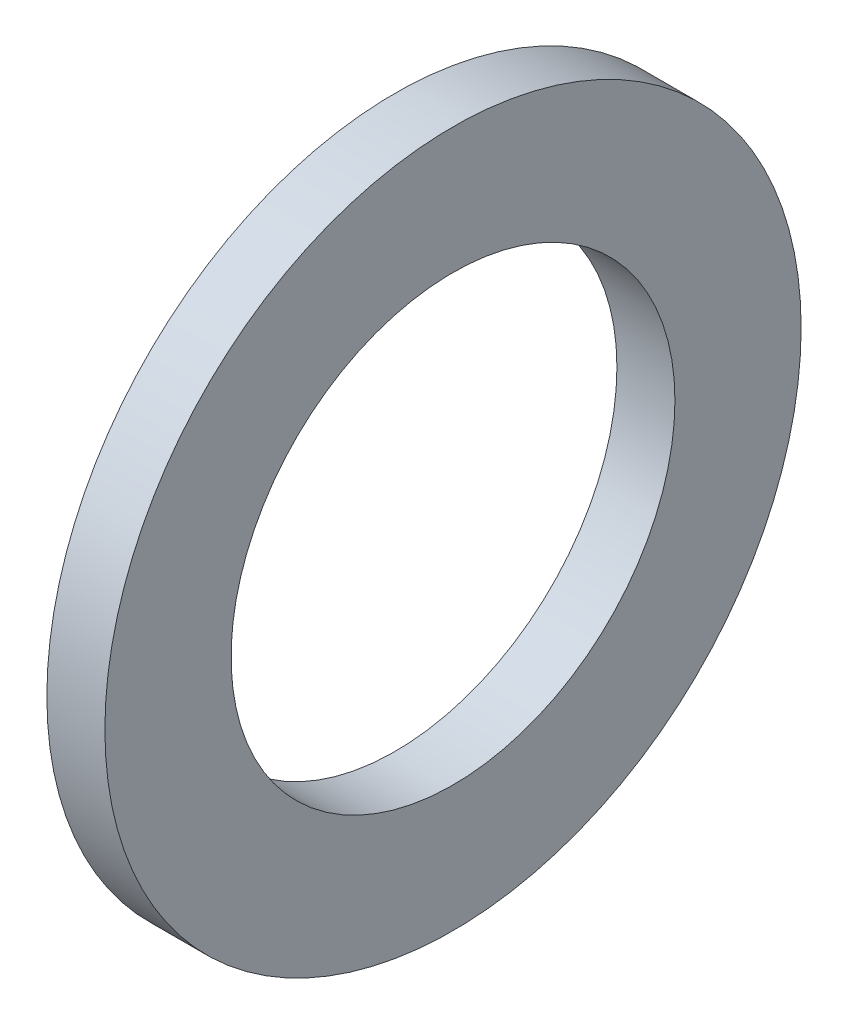
ISO-10303-21;
HEADER;
FILE_DESCRIPTION(('STEP AP214'),'2;1');
FILE_NAME('part.step','',(''),(''),'','','');
FILE_SCHEMA(('AUTOMOTIVE_DESIGN { 1 0 10303 214 1 1 1 1 }'));
ENDSEC;
DATA;
#1=APPLICATION_CONTEXT('core data for automotive mechanical design processes');
#2=APPLICATION_PROTOCOL_DEFINITION('international standard','automotive_design',2000,#1);
#3=PRODUCT_CONTEXT('',#1,'mechanical');
#4=PRODUCT('Part','Part','',(#3));
#5=PRODUCT_RELATED_PRODUCT_CATEGORY('part','',(#4));
#6=PRODUCT_DEFINITION_FORMATION('','',#4);
#7=PRODUCT_DEFINITION_CONTEXT('part definition',#1,'design');
#8=PRODUCT_DEFINITION('design','',#6,#7);
#9=PRODUCT_DEFINITION_SHAPE('','',#8);
#10=(LENGTH_UNIT() NAMED_UNIT(*) SI_UNIT(.MILLI.,.METRE.));
#11=(NAMED_UNIT(*) PLANE_ANGLE_UNIT() SI_UNIT($,.RADIAN.));
#12=(NAMED_UNIT(*) SI_UNIT($,.STERADIAN.) SOLID_ANGLE_UNIT());
#13=UNCERTAINTY_MEASURE_WITH_UNIT(LENGTH_MEASURE(1.E-05),#10,'distance_accuracy_value','');
#14=(GEOMETRIC_REPRESENTATION_CONTEXT(3) GLOBAL_UNCERTAINTY_ASSIGNED_CONTEXT((#13)) GLOBAL_UNIT_ASSIGNED_CONTEXT((#10,
#11,#12)) REPRESENTATION_CONTEXT('',''));
#15=CARTESIAN_POINT('',(0.,0.,0.));
#16=DIRECTION('',(0.,0.,1.));
#17=DIRECTION('',(1.,0.,0.));
#18=AXIS2_PLACEMENT_3D('',#15,#16,#17);
#19=CARTESIAN_POINT('',(0.008400000000002,12.0084,12.0084));
#20=DIRECTION('',(1.,0.,0.));
#21=DIRECTION('',(0.,0.,-1.));
#22=AXIS2_PLACEMENT_3D('',#19,#20,#21);
#23=PLANE('',#22);
#24=CARTESIAN_POINT('',(0.008400000000002,12.0084,12.0084));
#25=DIRECTION('',(1.,0.,0.));
#26=DIRECTION('',(0.,0.,-1.));
#27=AXIS2_PLACEMENT_3D('',#24,#25,#26);
#28=CIRCLE('',#27,7.65);
#29=CARTESIAN_POINT('',(0.008400000000002,12.0084,4.3584));
#30=VERTEX_POINT('',#29);
#31=EDGE_CURVE('E26',#30,#30,#28,.T.);
#32=ORIENTED_EDGE('',*,*,#31,.T.);
#33=EDGE_LOOP('',(#32));
#34=FACE_BOUND('',#33,.T.);
#35=CARTESIAN_POINT('',(0.008400000000002,12.0084,12.0084));
#36=DIRECTION('',(1.,0.,0.));
#37=DIRECTION('',(0.,0.,-1.));
#38=AXIS2_PLACEMENT_3D('',#35,#36,#37);
#39=CIRCLE('',#38,12.);
#40=CARTESIAN_POINT('',(0.008400000000002,12.0084,0.00840000000000042));
#41=VERTEX_POINT('',#40);
#42=EDGE_CURVE('E17',#41,#41,#39,.T.);
#43=ORIENTED_EDGE('',*,*,#42,.F.);
#44=EDGE_LOOP('',(#43));
#45=FACE_BOUND('',#44,.T.);
#46=ADVANCED_FACE('F14',(#34,#45),#23,.F.);
#47=CARTESIAN_POINT('',(0.008400000000002,12.0084,12.0084));
#48=DIRECTION('',(1.,0.,0.));
#49=DIRECTION('',(0.,0.,-1.));
#50=AXIS2_PLACEMENT_3D('',#47,#48,#49);
#51=CYLINDRICAL_SURFACE('',#50,12.);
#52=ORIENTED_EDGE('',*,*,#42,.T.);
#53=EDGE_LOOP('',(#52));
#54=FACE_BOUND('',#53,.T.);
#55=CARTESIAN_POINT('',(2.0084,12.0084,12.0084));
#56=DIRECTION('',(1.,0.,0.));
#57=DIRECTION('',(0.,0.,-1.));
#58=AXIS2_PLACEMENT_3D('',#55,#56,#57);
#59=CIRCLE('',#58,12.);
#60=CARTESIAN_POINT('',(2.0084,12.0084,0.00840000000000042));
#61=VERTEX_POINT('',#60);
#62=EDGE_CURVE('E21',#61,#61,#59,.T.);
#63=ORIENTED_EDGE('',*,*,#62,.F.);
#64=EDGE_LOOP('',(#63));
#65=FACE_BOUND('',#64,.T.);
#66=ADVANCED_FACE('F34',(#54,#65),#51,.T.);
#67=CARTESIAN_POINT('',(0.008400000000002,12.0084,12.0084));
#68=DIRECTION('',(1.,0.,0.));
#69=DIRECTION('',(0.,0.,-1.));
#70=AXIS2_PLACEMENT_3D('',#67,#68,#69);
#71=CYLINDRICAL_SURFACE('',#70,7.65);
#72=ORIENTED_EDGE('',*,*,#31,.F.);
#73=EDGE_LOOP('',(#72));
#74=FACE_BOUND('',#73,.T.);
#75=CARTESIAN_POINT('',(2.0084,12.0084,12.0084));
#76=DIRECTION('',(1.,0.,0.));
#77=DIRECTION('',(0.,0.,-1.));
#78=AXIS2_PLACEMENT_3D('',#75,#76,#77);
#79=CIRCLE('',#78,7.65);
#80=CARTESIAN_POINT('',(2.0084,12.0084,4.3584));
#81=VERTEX_POINT('',#80);
#82=EDGE_CURVE('E10',#81,#81,#79,.F.);
#83=ORIENTED_EDGE('',*,*,#82,.F.);
#84=EDGE_LOOP('',(#83));
#85=FACE_BOUND('',#84,.T.);
#86=ADVANCED_FACE('F42',(#74,#85),#71,.F.);
#87=CARTESIAN_POINT('',(2.0084,12.0084,12.0084));
#88=DIRECTION('',(1.,0.,0.));
#89=DIRECTION('',(0.,0.,-1.));
#90=AXIS2_PLACEMENT_3D('',#87,#88,#89);
#91=PLANE('',#90);
#92=ORIENTED_EDGE('',*,*,#82,.T.);
#93=EDGE_LOOP('',(#92));
#94=FACE_BOUND('',#93,.T.);
#95=ORIENTED_EDGE('',*,*,#62,.T.);
#96=EDGE_LOOP('',(#95));
#97=FACE_BOUND('',#96,.T.);
#98=ADVANCED_FACE('F43',(#94,#97),#91,.T.);
#99=CLOSED_SHELL('',(#46,#66,#86,#98));
#100=MANIFOLD_SOLID_BREP('B1',#99);
#101=ADVANCED_BREP_SHAPE_REPRESENTATION('',(#18,#100),#14);
#102=SHAPE_DEFINITION_REPRESENTATION(#9,#101);
ENDSEC;
END-ISO-10303-21;
